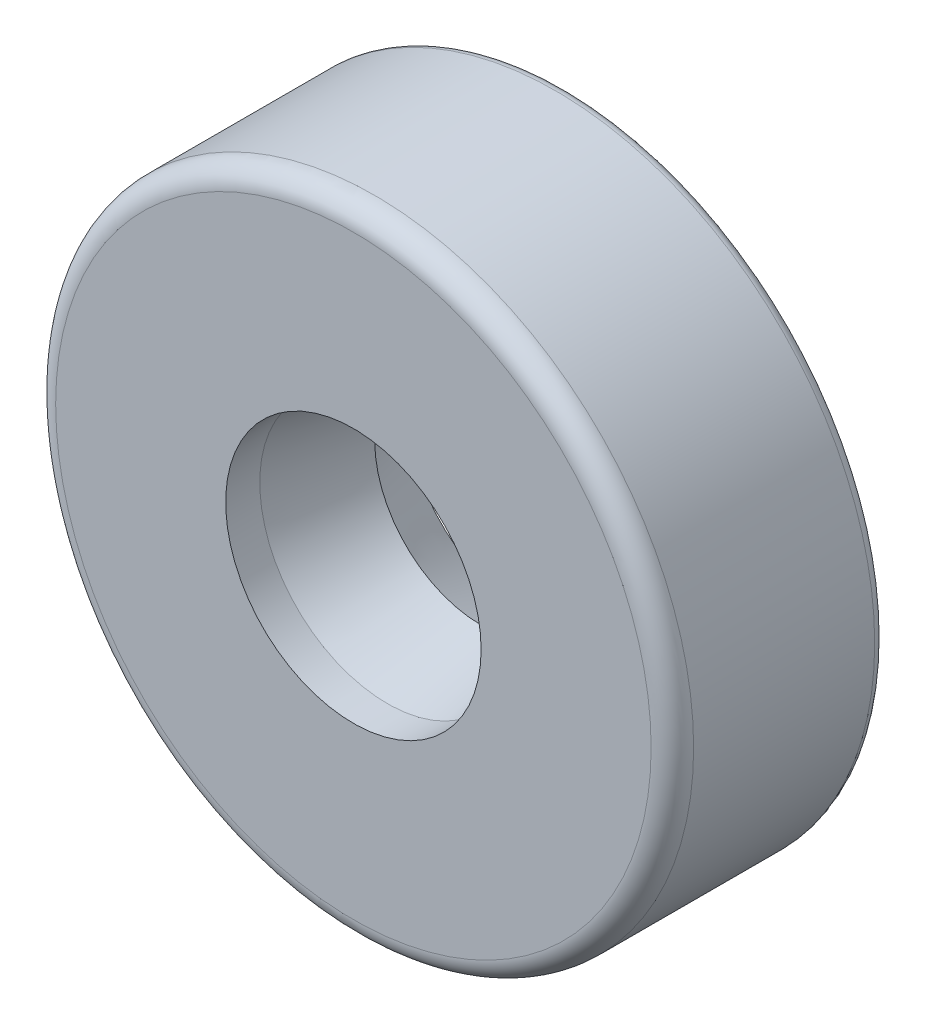
ISO-10303-21;
HEADER;
FILE_DESCRIPTION(('STEP AP214'),'2;1');
FILE_NAME('part.step','',(''),(''),'','','');
FILE_SCHEMA(('AUTOMOTIVE_DESIGN { 1 0 10303 214 1 1 1 1 }'));
ENDSEC;
DATA;
#1=APPLICATION_CONTEXT('core data for automotive mechanical design processes');
#2=APPLICATION_PROTOCOL_DEFINITION('international standard','automotive_design',2000,#1);
#3=PRODUCT_CONTEXT('',#1,'mechanical');
#4=PRODUCT('Part','Part','',(#3));
#5=PRODUCT_RELATED_PRODUCT_CATEGORY('part','',(#4));
#6=PRODUCT_DEFINITION_FORMATION('','',#4);
#7=PRODUCT_DEFINITION_CONTEXT('part definition',#1,'design');
#8=PRODUCT_DEFINITION('design','',#6,#7);
#9=PRODUCT_DEFINITION_SHAPE('','',#8);
#10=(LENGTH_UNIT() NAMED_UNIT(*) SI_UNIT(.MILLI.,.METRE.));
#11=(NAMED_UNIT(*) PLANE_ANGLE_UNIT() SI_UNIT($,.RADIAN.));
#12=(NAMED_UNIT(*) SI_UNIT($,.STERADIAN.) SOLID_ANGLE_UNIT());
#13=UNCERTAINTY_MEASURE_WITH_UNIT(LENGTH_MEASURE(1.E-05),#10,'distance_accuracy_value','');
#14=(GEOMETRIC_REPRESENTATION_CONTEXT(3) GLOBAL_UNCERTAINTY_ASSIGNED_CONTEXT((#13)) GLOBAL_UNIT_ASSIGNED_CONTEXT((#10,
#11,#12)) REPRESENTATION_CONTEXT('',''));
#15=CARTESIAN_POINT('',(0.,0.,0.));
#16=DIRECTION('',(0.,0.,1.));
#17=DIRECTION('',(1.,0.,0.));
#18=AXIS2_PLACEMENT_3D('',#15,#16,#17);
#19=CARTESIAN_POINT('',(0.,0.,-0.635000000000001));
#20=DIRECTION('',(0.,0.,1.));
#21=DIRECTION('',(1.,0.,0.));
#22=AXIS2_PLACEMENT_3D('',#19,#20,#21);
#23=TOROIDAL_SURFACE('',#22,4.44246000000001,0.514905625000002);
#24=CARTESIAN_POINT('',(4.95736562500001,0.,-0.635000000000001));
#25=VERTEX_POINT('',#24);
#26=VERTEX_LOOP('',#25);
#27=FACE_BOUND('',#26,.T.);
#28=ADVANCED_FACE('F38',(#27),#23,.T.);
#29=CLOSED_SHELL('',(#28));
#30=MANIFOLD_SOLID_BREP('B2',#29);
#31=CARTESIAN_POINT('',(0.,0.,2.54127));
#32=DIRECTION('',(0.,0.,1.));
#33=DIRECTION('',(1.,0.,0.));
#34=AXIS2_PLACEMENT_3D('',#31,#32,#33);
#35=TOROIDAL_SURFACE('',#34,8.87857,0.63373);
#36=CARTESIAN_POINT('',(0.,0.,3.175));
#37=DIRECTION('',(0.,0.,1.));
#38=DIRECTION('',(1.,0.,0.));
#39=AXIS2_PLACEMENT_3D('',#36,#37,#38);
#40=CIRCLE('',#39,8.87857);
#41=CARTESIAN_POINT('',(8.87857,0.,3.175));
#42=VERTEX_POINT('',#41);
#43=EDGE_CURVE('E37',#42,#42,#40,.T.);
#44=ORIENTED_EDGE('',*,*,#43,.F.);
#45=EDGE_LOOP('',(#44));
#46=FACE_BOUND('',#45,.T.);
#47=CARTESIAN_POINT('',(0.,0.,2.54127));
#48=DIRECTION('',(0.,0.,1.));
#49=DIRECTION('',(1.,0.,0.));
#50=AXIS2_PLACEMENT_3D('',#47,#48,#49);
#51=CIRCLE('',#50,9.5123);
#52=CARTESIAN_POINT('',(9.5123,0.,2.54127));
#53=VERTEX_POINT('',#52);
#54=EDGE_CURVE('E108',#53,#53,#51,.T.);
#55=ORIENTED_EDGE('',*,*,#54,.T.);
#56=EDGE_LOOP('',(#55));
#57=FACE_BOUND('',#56,.T.);
#58=ADVANCED_FACE('F50',(#46,#57),#35,.T.);
#59=CARTESIAN_POINT('',(0.,8.87857,3.175));
#60=DIRECTION('',(0.,0.,-1.));
#61=DIRECTION('',(-1.,0.,0.));
#62=AXIS2_PLACEMENT_3D('',#59,#60,#61);
#63=PLANE('',#62);
#64=CARTESIAN_POINT('',(0.,0.,3.175));
#65=DIRECTION('',(0.,0.,1.));
#66=DIRECTION('',(1.,0.,0.));
#67=AXIS2_PLACEMENT_3D('',#64,#65,#66);
#68=CIRCLE('',#67,3.80873);
#69=CARTESIAN_POINT('',(3.80873,0.,3.175));
#70=VERTEX_POINT('',#69);
#71=EDGE_CURVE('E56',#70,#70,#68,.T.);
#72=ORIENTED_EDGE('',*,*,#71,.F.);
#73=EDGE_LOOP('',(#72));
#74=FACE_BOUND('',#73,.T.);
#75=ORIENTED_EDGE('',*,*,#43,.T.);
#76=EDGE_LOOP('',(#75));
#77=FACE_BOUND('',#76,.T.);
#78=ADVANCED_FACE('F205',(#74,#77),#63,.F.);
#79=CARTESIAN_POINT('',(0.,0.,-3.175));
#80=DIRECTION('',(0.,0.,1.));
#81=DIRECTION('',(1.,0.,0.));
#82=AXIS2_PLACEMENT_3D('',#79,#80,#81);
#83=CYLINDRICAL_SURFACE('',#82,3.80873);
#84=CARTESIAN_POINT('',(0.,0.,2.159));
#85=DIRECTION('',(0.,0.,1.));
#86=DIRECTION('',(1.,0.,0.));
#87=AXIS2_PLACEMENT_3D('',#84,#85,#86);
#88=CIRCLE('',#87,3.80873);
#89=CARTESIAN_POINT('',(3.80873,0.,2.159));
#90=VERTEX_POINT('',#89);
#91=EDGE_CURVE('E60',#90,#90,#88,.T.);
#92=ORIENTED_EDGE('',*,*,#91,.F.);
#93=EDGE_LOOP('',(#92));
#94=FACE_BOUND('',#93,.T.);
#95=ORIENTED_EDGE('',*,*,#71,.T.);
#96=EDGE_LOOP('',(#95));
#97=FACE_BOUND('',#96,.T.);
#98=ADVANCED_FACE('F200',(#94,#97),#83,.F.);
#99=CARTESIAN_POINT('',(0.,0.,2.159));
#100=DIRECTION('',(0.,0.,1.));
#101=DIRECTION('',(1.,0.,0.));
#102=AXIS2_PLACEMENT_3D('',#99,#100,#101);
#103=CONICAL_SURFACE('',#102,3.80873,0.223044338666327);
#104=CARTESIAN_POINT('',(0.,0.,-0.635000000000001));
#105=DIRECTION('',(0.,0.,1.));
#106=DIRECTION('',(1.,0.,0.));
#107=AXIS2_PLACEMENT_3D('',#104,#105,#106);
#108=CIRCLE('',#107,3.17500000000001);
#109=CARTESIAN_POINT('',(3.17500000000001,0.,-0.635000000000001));
#110=VERTEX_POINT('',#109);
#111=EDGE_CURVE('E64',#110,#110,#108,.T.);
#112=ORIENTED_EDGE('',*,*,#111,.F.);
#113=EDGE_LOOP('',(#112));
#114=FACE_BOUND('',#113,.T.);
#115=ORIENTED_EDGE('',*,*,#91,.T.);
#116=EDGE_LOOP('',(#115));
#117=FACE_BOUND('',#116,.T.);
#118=ADVANCED_FACE('F194',(#114,#117),#103,.F.);
#119=CARTESIAN_POINT('',(0.,0.,-0.635000000000001));
#120=DIRECTION('',(0.,0.,-1.));
#121=DIRECTION('',(-1.,0.,0.));
#122=AXIS2_PLACEMENT_3D('',#119,#120,#121);
#123=CONICAL_SURFACE('',#122,3.17500000000001,0.394080850508754);
#124=CARTESIAN_POINT('',(0.,0.,-2.159));
#125=DIRECTION('',(0.,0.,1.));
#126=DIRECTION('',(1.,0.,0.));
#127=AXIS2_PLACEMENT_3D('',#124,#125,#126);
#128=CIRCLE('',#127,3.80873);
#129=CARTESIAN_POINT('',(3.80873,0.,-2.159));
#130=VERTEX_POINT('',#129);
#131=EDGE_CURVE('E69',#130,#130,#128,.T.);
#132=ORIENTED_EDGE('',*,*,#131,.F.);
#133=EDGE_LOOP('',(#132));
#134=FACE_BOUND('',#133,.T.);
#135=ORIENTED_EDGE('',*,*,#111,.T.);
#136=EDGE_LOOP('',(#135));
#137=FACE_BOUND('',#136,.T.);
#138=ADVANCED_FACE('F188',(#134,#137),#123,.F.);
#139=CARTESIAN_POINT('',(0.,3.80873,-2.159));
#140=DIRECTION('',(0.,0.,1.));
#141=DIRECTION('',(1.,0.,0.));
#142=AXIS2_PLACEMENT_3D('',#139,#140,#141);
#143=PLANE('',#142);
#144=CARTESIAN_POINT('',(0.,0.,-2.159));
#145=DIRECTION('',(0.,0.,1.));
#146=DIRECTION('',(1.,0.,0.));
#147=AXIS2_PLACEMENT_3D('',#144,#145,#146);
#148=CIRCLE('',#147,4.44246000000001);
#149=CARTESIAN_POINT('',(4.44246000000001,0.,-2.159));
#150=VERTEX_POINT('',#149);
#151=EDGE_CURVE('E72',#150,#150,#148,.T.);
#152=ORIENTED_EDGE('',*,*,#151,.F.);
#153=EDGE_LOOP('',(#152));
#154=FACE_BOUND('',#153,.T.);
#155=ORIENTED_EDGE('',*,*,#131,.T.);
#156=EDGE_LOOP('',(#155));
#157=FACE_BOUND('',#156,.T.);
#158=ADVANCED_FACE('F182',(#154,#157),#143,.F.);
#159=CARTESIAN_POINT('',(0.,0.,-3.175));
#160=DIRECTION('',(0.,0.,1.));
#161=DIRECTION('',(1.,0.,0.));
#162=AXIS2_PLACEMENT_3D('',#159,#160,#161);
#163=CYLINDRICAL_SURFACE('',#162,4.44246000000001);
#164=CARTESIAN_POINT('',(0.,0.,-1.149905625));
#165=DIRECTION('',(0.,0.,1.));
#166=DIRECTION('',(1.,0.,0.));
#167=AXIS2_PLACEMENT_3D('',#164,#165,#166);
#168=CIRCLE('',#167,4.44246000000001);
#169=CARTESIAN_POINT('',(4.44246000000001,0.,-1.149905625));
#170=VERTEX_POINT('',#169);
#171=EDGE_CURVE('E75',#170,#170,#168,.T.);
#172=ORIENTED_EDGE('',*,*,#171,.F.);
#173=EDGE_LOOP('',(#172));
#174=FACE_BOUND('',#173,.T.);
#175=ORIENTED_EDGE('',*,*,#151,.T.);
#176=EDGE_LOOP('',(#175));
#177=FACE_BOUND('',#176,.T.);
#178=ADVANCED_FACE('F176',(#174,#177),#163,.T.);
#179=CARTESIAN_POINT('',(0.,0.,-0.635000000000001));
#180=DIRECTION('',(0.,0.,1.));
#181=DIRECTION('',(1.,0.,0.));
#182=AXIS2_PLACEMENT_3D('',#179,#180,#181);
#183=TOROIDAL_SURFACE('',#182,4.44246000000001,0.514905625000002);
#184=CARTESIAN_POINT('',(0.,0.,-0.120094374999999));
#185=DIRECTION('',(0.,0.,1.));
#186=DIRECTION('',(1.,0.,0.));
#187=AXIS2_PLACEMENT_3D('',#184,#185,#186);
#188=CIRCLE('',#187,4.44246000000001);
#189=CARTESIAN_POINT('',(4.44246000000001,0.,-0.120094374999999));
#190=VERTEX_POINT('',#189);
#191=EDGE_CURVE('E78',#190,#190,#188,.T.);
#192=ORIENTED_EDGE('',*,*,#191,.F.);
#193=EDGE_LOOP('',(#192));
#194=FACE_BOUND('',#193,.T.);
#195=ORIENTED_EDGE('',*,*,#171,.T.);
#196=EDGE_LOOP('',(#195));
#197=FACE_BOUND('',#196,.T.);
#198=ADVANCED_FACE('F170',(#194,#197),#183,.F.);
#199=CARTESIAN_POINT('',(0.,0.,-3.175));
#200=DIRECTION('',(0.,0.,1.));
#201=DIRECTION('',(1.,0.,0.));
#202=AXIS2_PLACEMENT_3D('',#199,#200,#201);
#203=CYLINDRICAL_SURFACE('',#202,4.44246000000001);
#204=CARTESIAN_POINT('',(0.,0.,2.159));
#205=DIRECTION('',(0.,0.,1.));
#206=DIRECTION('',(1.,0.,0.));
#207=AXIS2_PLACEMENT_3D('',#204,#205,#206);
#208=CIRCLE('',#207,4.44246000000001);
#209=CARTESIAN_POINT('',(4.44246000000001,0.,2.159));
#210=VERTEX_POINT('',#209);
#211=EDGE_CURVE('E81',#210,#210,#208,.T.);
#212=ORIENTED_EDGE('',*,*,#211,.F.);
#213=EDGE_LOOP('',(#212));
#214=FACE_BOUND('',#213,.T.);
#215=ORIENTED_EDGE('',*,*,#191,.T.);
#216=EDGE_LOOP('',(#215));
#217=FACE_BOUND('',#216,.T.);
#218=ADVANCED_FACE('F164',(#214,#217),#203,.T.);
#219=CARTESIAN_POINT('',(0.,4.44246000000001,2.159));
#220=DIRECTION('',(0.,0.,1.));
#221=DIRECTION('',(1.,0.,0.));
#222=AXIS2_PLACEMENT_3D('',#219,#220,#221);
#223=PLANE('',#222);
#224=CARTESIAN_POINT('',(0.,0.,2.159));
#225=DIRECTION('',(0.,0.,1.));
#226=DIRECTION('',(1.,0.,0.));
#227=AXIS2_PLACEMENT_3D('',#224,#225,#226);
#228=CIRCLE('',#227,8.363664375);
#229=CARTESIAN_POINT('',(8.363664375,0.,2.159));
#230=VERTEX_POINT('',#229);
#231=EDGE_CURVE('E84',#230,#230,#228,.T.);
#232=ORIENTED_EDGE('',*,*,#231,.F.);
#233=EDGE_LOOP('',(#232));
#234=FACE_BOUND('',#233,.T.);
#235=ORIENTED_EDGE('',*,*,#211,.T.);
#236=EDGE_LOOP('',(#235));
#237=FACE_BOUND('',#236,.T.);
#238=ADVANCED_FACE('F158',(#234,#237),#223,.F.);
#239=CARTESIAN_POINT('',(0.,0.,1.644094375));
#240=DIRECTION('',(0.,0.,1.));
#241=DIRECTION('',(1.,0.,0.));
#242=AXIS2_PLACEMENT_3D('',#239,#240,#241);
#243=TOROIDAL_SURFACE('',#242,8.363664375,0.514905625000002);
#244=CARTESIAN_POINT('',(0.,0.,1.644094375));
#245=DIRECTION('',(0.,0.,1.));
#246=DIRECTION('',(1.,0.,0.));
#247=AXIS2_PLACEMENT_3D('',#244,#245,#246);
#248=CIRCLE('',#247,8.87857);
#249=CARTESIAN_POINT('',(8.87857,0.,1.644094375));
#250=VERTEX_POINT('',#249);
#251=EDGE_CURVE('E87',#250,#250,#248,.T.);
#252=ORIENTED_EDGE('',*,*,#251,.F.);
#253=EDGE_LOOP('',(#252));
#254=FACE_BOUND('',#253,.T.);
#255=ORIENTED_EDGE('',*,*,#231,.T.);
#256=EDGE_LOOP('',(#255));
#257=FACE_BOUND('',#256,.T.);
#258=ADVANCED_FACE('F152',(#254,#257),#243,.F.);
#259=CARTESIAN_POINT('',(0.,0.,-3.175));
#260=DIRECTION('',(0.,0.,1.));
#261=DIRECTION('',(1.,0.,0.));
#262=AXIS2_PLACEMENT_3D('',#259,#260,#261);
#263=CYLINDRICAL_SURFACE('',#262,8.87857);
#264=CARTESIAN_POINT('',(0.,0.,-2.6997025));
#265=DIRECTION('',(0.,0.,1.));
#266=DIRECTION('',(1.,0.,0.));
#267=AXIS2_PLACEMENT_3D('',#264,#265,#266);
#268=CIRCLE('',#267,8.87857);
#269=CARTESIAN_POINT('',(8.87857,0.,-2.6997025));
#270=VERTEX_POINT('',#269);
#271=EDGE_CURVE('E90',#270,#270,#268,.T.);
#272=ORIENTED_EDGE('',*,*,#271,.F.);
#273=EDGE_LOOP('',(#272));
#274=FACE_BOUND('',#273,.T.);
#275=ORIENTED_EDGE('',*,*,#251,.T.);
#276=EDGE_LOOP('',(#275));
#277=FACE_BOUND('',#276,.T.);
#278=ADVANCED_FACE('F146',(#274,#277),#263,.F.);
#279=CARTESIAN_POINT('',(0.,0.,-2.858135));
#280=DIRECTION('',(0.,0.,1.));
#281=DIRECTION('',(1.,0.,0.));
#282=AXIS2_PLACEMENT_3D('',#279,#280,#281);
#283=TOROIDAL_SURFACE('',#282,8.87857,0.158432500000001);
#284=CARTESIAN_POINT('',(0.,0.,-2.99534156978509));
#285=DIRECTION('',(0.,0.,1.));
#286=DIRECTION('',(1.,0.,0.));
#287=AXIS2_PLACEMENT_3D('',#284,#285,#286);
#288=CIRCLE('',#287,8.79935375000001);
#289=CARTESIAN_POINT('',(8.79935375000001,0.,-2.99534156978509));
#290=VERTEX_POINT('',#289);
#291=EDGE_CURVE('E93',#290,#290,#288,.T.);
#292=ORIENTED_EDGE('',*,*,#291,.F.);
#293=EDGE_LOOP('',(#292));
#294=FACE_BOUND('',#293,.T.);
#295=ORIENTED_EDGE('',*,*,#271,.T.);
#296=EDGE_LOOP('',(#295));
#297=FACE_BOUND('',#296,.T.);
#298=ADVANCED_FACE('F140',(#294,#297),#283,.F.);
#299=CARTESIAN_POINT('',(0.,0.,-2.99534156978509));
#300=DIRECTION('',(0.,0.,1.));
#301=DIRECTION('',(1.,0.,0.));
#302=AXIS2_PLACEMENT_3D('',#299,#300,#301);
#303=CONICAL_SURFACE('',#302,8.79935375000001,0.523598775598168);
#304=CARTESIAN_POINT('',(0.,0.,-3.13254813957018));
#305=DIRECTION('',(0.,0.,1.));
#306=DIRECTION('',(1.,0.,0.));
#307=AXIS2_PLACEMENT_3D('',#304,#305,#306);
#308=CIRCLE('',#307,8.72013750000003);
#309=CARTESIAN_POINT('',(8.72013750000003,0.,-3.13254813957018));
#310=VERTEX_POINT('',#309);
#311=EDGE_CURVE('E96',#310,#310,#308,.T.);
#312=ORIENTED_EDGE('',*,*,#311,.F.);
#313=EDGE_LOOP('',(#312));
#314=FACE_BOUND('',#313,.T.);
#315=ORIENTED_EDGE('',*,*,#291,.T.);
#316=EDGE_LOOP('',(#315));
#317=FACE_BOUND('',#316,.T.);
#318=ADVANCED_FACE('F134',(#314,#317),#303,.F.);
#319=CARTESIAN_POINT('',(0.,0.,-2.858135));
#320=DIRECTION('',(0.,0.,1.));
#321=DIRECTION('',(1.,0.,0.));
#322=AXIS2_PLACEMENT_3D('',#319,#320,#321);
#323=TOROIDAL_SURFACE('',#322,8.87857,0.316864999999998);
#324=CARTESIAN_POINT('',(0.,0.,-3.175));
#325=DIRECTION('',(0.,0.,1.));
#326=DIRECTION('',(1.,0.,0.));
#327=AXIS2_PLACEMENT_3D('',#324,#325,#326);
#328=CIRCLE('',#327,8.87857);
#329=CARTESIAN_POINT('',(8.87857,0.,-3.175));
#330=VERTEX_POINT('',#329);
#331=EDGE_CURVE('E99',#330,#330,#328,.T.);
#332=ORIENTED_EDGE('',*,*,#331,.F.);
#333=EDGE_LOOP('',(#332));
#334=FACE_BOUND('',#333,.T.);
#335=ORIENTED_EDGE('',*,*,#311,.T.);
#336=EDGE_LOOP('',(#335));
#337=FACE_BOUND('',#336,.T.);
#338=ADVANCED_FACE('F128',(#334,#337),#323,.T.);
#339=CARTESIAN_POINT('',(0.,8.87856999999999,-3.175));
#340=DIRECTION('',(0.,0.,1.));
#341=DIRECTION('',(1.,0.,0.));
#342=AXIS2_PLACEMENT_3D('',#339,#340,#341);
#343=PLANE('',#342);
#344=CARTESIAN_POINT('',(0.,0.,-3.175));
#345=DIRECTION('',(0.,0.,1.));
#346=DIRECTION('',(1.,0.,0.));
#347=AXIS2_PLACEMENT_3D('',#344,#345,#346);
#348=CIRCLE('',#347,9.195435);
#349=CARTESIAN_POINT('',(9.195435,0.,-3.175));
#350=VERTEX_POINT('',#349);
#351=EDGE_CURVE('E102',#350,#350,#348,.T.);
#352=ORIENTED_EDGE('',*,*,#351,.F.);
#353=EDGE_LOOP('',(#352));
#354=FACE_BOUND('',#353,.T.);
#355=ORIENTED_EDGE('',*,*,#331,.T.);
#356=EDGE_LOOP('',(#355));
#357=FACE_BOUND('',#356,.T.);
#358=ADVANCED_FACE('F122',(#354,#357),#343,.F.);
#359=CARTESIAN_POINT('',(0.,0.,-2.858135));
#360=DIRECTION('',(0.,0.,1.));
#361=DIRECTION('',(1.,0.,0.));
#362=AXIS2_PLACEMENT_3D('',#359,#360,#361);
#363=TOROIDAL_SURFACE('',#362,9.195435,0.316864999999999);
#364=CARTESIAN_POINT('',(0.,0.,-2.858135));
#365=DIRECTION('',(0.,0.,1.));
#366=DIRECTION('',(1.,0.,0.));
#367=AXIS2_PLACEMENT_3D('',#364,#365,#366);
#368=CIRCLE('',#367,9.5123);
#369=CARTESIAN_POINT('',(9.5123,0.,-2.858135));
#370=VERTEX_POINT('',#369);
#371=EDGE_CURVE('E105',#370,#370,#368,.T.);
#372=ORIENTED_EDGE('',*,*,#371,.F.);
#373=EDGE_LOOP('',(#372));
#374=FACE_BOUND('',#373,.T.);
#375=ORIENTED_EDGE('',*,*,#351,.T.);
#376=EDGE_LOOP('',(#375));
#377=FACE_BOUND('',#376,.T.);
#378=ADVANCED_FACE('F116',(#374,#377),#363,.T.);
#379=CARTESIAN_POINT('',(0.,0.,-3.175));
#380=DIRECTION('',(0.,0.,1.));
#381=DIRECTION('',(1.,0.,0.));
#382=AXIS2_PLACEMENT_3D('',#379,#380,#381);
#383=CYLINDRICAL_SURFACE('',#382,9.5123);
#384=ORIENTED_EDGE('',*,*,#54,.F.);
#385=EDGE_LOOP('',(#384));
#386=FACE_BOUND('',#385,.T.);
#387=ORIENTED_EDGE('',*,*,#371,.T.);
#388=EDGE_LOOP('',(#387));
#389=FACE_BOUND('',#388,.T.);
#390=ADVANCED_FACE('F113',(#386,#389),#383,.T.);
#391=CLOSED_SHELL('',(#58,#78,#98,#118,#138,#158,#178,#198,#218,#238,#258,#278,#298,#318,#338,
#358,#378,#390));
#392=MANIFOLD_SOLID_BREP('B6',#391);
#393=ADVANCED_BREP_SHAPE_REPRESENTATION('',(#18,#30,#392),#14);
#394=SHAPE_DEFINITION_REPRESENTATION(#9,#393);
ENDSEC;
END-ISO-10303-21;
